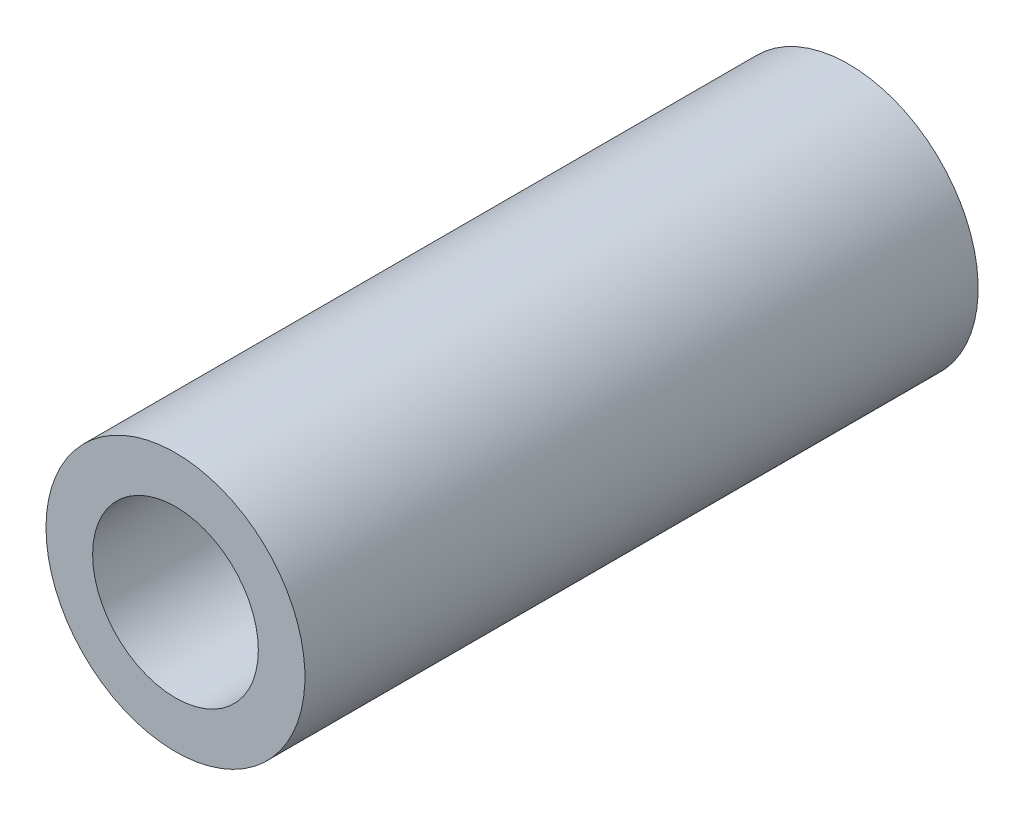
ISO-10303-21;
HEADER;
FILE_DESCRIPTION(('STEP AP214'),'2;1');
FILE_NAME('part.step','',(''),(''),'','','');
FILE_SCHEMA(('AUTOMOTIVE_DESIGN { 1 0 10303 214 1 1 1 1 }'));
ENDSEC;
DATA;
#1=APPLICATION_CONTEXT('core data for automotive mechanical design processes');
#2=APPLICATION_PROTOCOL_DEFINITION('international standard','automotive_design',2000,#1);
#3=PRODUCT_CONTEXT('',#1,'mechanical');
#4=PRODUCT('Part','Part','',(#3));
#5=PRODUCT_RELATED_PRODUCT_CATEGORY('part','',(#4));
#6=PRODUCT_DEFINITION_FORMATION('','',#4);
#7=PRODUCT_DEFINITION_CONTEXT('part definition',#1,'design');
#8=PRODUCT_DEFINITION('design','',#6,#7);
#9=PRODUCT_DEFINITION_SHAPE('','',#8);
#10=(LENGTH_UNIT() NAMED_UNIT(*) SI_UNIT(.MILLI.,.METRE.));
#11=(NAMED_UNIT(*) PLANE_ANGLE_UNIT() SI_UNIT($,.RADIAN.));
#12=(NAMED_UNIT(*) SI_UNIT($,.STERADIAN.) SOLID_ANGLE_UNIT());
#13=UNCERTAINTY_MEASURE_WITH_UNIT(LENGTH_MEASURE(1.E-05),#10,'distance_accuracy_value','');
#14=(GEOMETRIC_REPRESENTATION_CONTEXT(3) GLOBAL_UNCERTAINTY_ASSIGNED_CONTEXT((#13)) GLOBAL_UNIT_ASSIGNED_CONTEXT((#10,
#11,#12)) REPRESENTATION_CONTEXT('',''));
#15=CARTESIAN_POINT('',(0.,0.,0.));
#16=DIRECTION('',(0.,0.,1.));
#17=DIRECTION('',(1.,0.,0.));
#18=AXIS2_PLACEMENT_3D('',#15,#16,#17);
#19=CARTESIAN_POINT('',(0.,0.,13.));
#20=DIRECTION('',(0.,0.,1.));
#21=DIRECTION('',(1.,0.,0.));
#22=AXIS2_PLACEMENT_3D('',#19,#20,#21);
#23=PLANE('',#22);
#24=CARTESIAN_POINT('',(0.,0.,13.));
#25=DIRECTION('',(0.,0.,1.));
#26=DIRECTION('',(1.,0.,0.));
#27=AXIS2_PLACEMENT_3D('',#24,#25,#26);
#28=CIRCLE('',#27,2.5);
#29=CARTESIAN_POINT('',(-2.5,0.,13.));
#30=VERTEX_POINT('',#29);
#31=EDGE_CURVE('E10',#30,#30,#28,.T.);
#32=ORIENTED_EDGE('',*,*,#31,.T.);
#33=EDGE_LOOP('',(#32));
#34=FACE_BOUND('',#33,.T.);
#35=CARTESIAN_POINT('',(0.,0.,13.));
#36=DIRECTION('',(0.,0.,1.));
#37=DIRECTION('',(1.,0.,0.));
#38=AXIS2_PLACEMENT_3D('',#35,#36,#37);
#39=CIRCLE('',#38,1.6);
#40=CARTESIAN_POINT('',(-1.6,0.,13.));
#41=VERTEX_POINT('',#40);
#42=EDGE_CURVE('E46',#41,#41,#39,.T.);
#43=ORIENTED_EDGE('',*,*,#42,.F.);
#44=EDGE_LOOP('',(#43));
#45=FACE_BOUND('',#44,.T.);
#46=ADVANCED_FACE('F35',(#34,#45),#23,.T.);
#47=CARTESIAN_POINT('',(0.,0.,0.));
#48=DIRECTION('',(0.,0.,1.));
#49=DIRECTION('',(1.,0.,0.));
#50=AXIS2_PLACEMENT_3D('',#47,#48,#49);
#51=PLANE('',#50);
#52=CARTESIAN_POINT('',(0.,0.,0.));
#53=DIRECTION('',(0.,0.,1.));
#54=DIRECTION('',(1.,0.,0.));
#55=AXIS2_PLACEMENT_3D('',#52,#53,#54);
#56=CIRCLE('',#55,2.5);
#57=CARTESIAN_POINT('',(-2.5,0.,0.));
#58=VERTEX_POINT('',#57);
#59=EDGE_CURVE('E39',#58,#58,#56,.T.);
#60=ORIENTED_EDGE('',*,*,#59,.F.);
#61=EDGE_LOOP('',(#60));
#62=FACE_BOUND('',#61,.T.);
#63=CARTESIAN_POINT('',(0.,0.,0.));
#64=DIRECTION('',(0.,0.,1.));
#65=DIRECTION('',(1.,0.,0.));
#66=AXIS2_PLACEMENT_3D('',#63,#64,#65);
#67=CIRCLE('',#66,1.6);
#68=CARTESIAN_POINT('',(-1.6,0.,0.));
#69=VERTEX_POINT('',#68);
#70=EDGE_CURVE('E48',#69,#69,#67,.T.);
#71=ORIENTED_EDGE('',*,*,#70,.T.);
#72=EDGE_LOOP('',(#71));
#73=FACE_BOUND('',#72,.T.);
#74=ADVANCED_FACE('F58',(#62,#73),#51,.F.);
#75=CARTESIAN_POINT('',(0.,0.,13.));
#76=DIRECTION('',(0.,0.,-1.));
#77=DIRECTION('',(-1.,0.,0.));
#78=AXIS2_PLACEMENT_3D('',#75,#76,#77);
#79=CYLINDRICAL_SURFACE('',#78,2.5);
#80=CARTESIAN_POINT('',(-2.5,0.,13.));
#81=CARTESIAN_POINT('',(-2.5,0.,12.8645833333333));
#82=CARTESIAN_POINT('',(-2.5,0.,12.7291666666667));
#83=CARTESIAN_POINT('',(-2.5,0.,12.4583333333333));
#84=CARTESIAN_POINT('',(-2.5,0.,12.3229166666667));
#85=CARTESIAN_POINT('',(-2.5,0.,12.0520833333333));
#86=CARTESIAN_POINT('',(-2.5,0.,11.9166666666667));
#87=CARTESIAN_POINT('',(-2.5,0.,11.6458333333333));
#88=CARTESIAN_POINT('',(-2.5,0.,11.5104166666667));
#89=CARTESIAN_POINT('',(-2.5,0.,11.2395833333333));
#90=CARTESIAN_POINT('',(-2.5,0.,11.1041666666667));
#91=CARTESIAN_POINT('',(-2.5,0.,10.8333333333333));
#92=CARTESIAN_POINT('',(-2.5,0.,10.6979166666667));
#93=CARTESIAN_POINT('',(-2.5,0.,10.4270833333333));
#94=CARTESIAN_POINT('',(-2.5,0.,10.2916666666667));
#95=CARTESIAN_POINT('',(-2.5,0.,10.0208333333333));
#96=CARTESIAN_POINT('',(-2.5,0.,9.88541666666667));
#97=CARTESIAN_POINT('',(-2.5,0.,9.61458333333333));
#98=CARTESIAN_POINT('',(-2.5,0.,9.47916666666667));
#99=CARTESIAN_POINT('',(-2.5,0.,9.20833333333333));
#100=CARTESIAN_POINT('',(-2.5,0.,9.07291666666667));
#101=CARTESIAN_POINT('',(-2.5,0.,8.80208333333333));
#102=CARTESIAN_POINT('',(-2.5,0.,8.66666666666667));
#103=CARTESIAN_POINT('',(-2.5,0.,8.39583333333333));
#104=CARTESIAN_POINT('',(-2.5,0.,8.26041666666667));
#105=CARTESIAN_POINT('',(-2.5,0.,7.98958333333333));
#106=CARTESIAN_POINT('',(-2.5,0.,7.85416666666667));
#107=CARTESIAN_POINT('',(-2.5,0.,7.58333333333333));
#108=CARTESIAN_POINT('',(-2.5,0.,7.44791666666667));
#109=CARTESIAN_POINT('',(-2.5,0.,7.17708333333333));
#110=CARTESIAN_POINT('',(-2.5,0.,7.04166666666667));
#111=CARTESIAN_POINT('',(-2.5,0.,6.77083333333333));
#112=CARTESIAN_POINT('',(-2.5,0.,6.63541666666667));
#113=CARTESIAN_POINT('',(-2.5,0.,6.36458333333333));
#114=CARTESIAN_POINT('',(-2.5,0.,6.22916666666667));
#115=CARTESIAN_POINT('',(-2.5,0.,5.95833333333333));
#116=CARTESIAN_POINT('',(-2.5,0.,5.82291666666667));
#117=CARTESIAN_POINT('',(-2.5,0.,5.55208333333333));
#118=CARTESIAN_POINT('',(-2.5,0.,5.41666666666667));
#119=CARTESIAN_POINT('',(-2.5,0.,5.14583333333333));
#120=CARTESIAN_POINT('',(-2.5,0.,5.01041666666667));
#121=CARTESIAN_POINT('',(-2.5,0.,4.73958333333333));
#122=CARTESIAN_POINT('',(-2.5,0.,4.60416666666667));
#123=CARTESIAN_POINT('',(-2.5,0.,4.33333333333333));
#124=CARTESIAN_POINT('',(-2.5,0.,4.19791666666667));
#125=CARTESIAN_POINT('',(-2.5,0.,3.92708333333333));
#126=CARTESIAN_POINT('',(-2.5,0.,3.79166666666667));
#127=CARTESIAN_POINT('',(-2.5,0.,3.52083333333333));
#128=CARTESIAN_POINT('',(-2.5,0.,3.38541666666667));
#129=CARTESIAN_POINT('',(-2.5,0.,3.11458333333333));
#130=CARTESIAN_POINT('',(-2.5,0.,2.97916666666667));
#131=CARTESIAN_POINT('',(-2.5,0.,2.70833333333333));
#132=CARTESIAN_POINT('',(-2.5,0.,2.57291666666667));
#133=CARTESIAN_POINT('',(-2.5,0.,2.30208333333333));
#134=CARTESIAN_POINT('',(-2.5,0.,2.16666666666667));
#135=CARTESIAN_POINT('',(-2.5,0.,1.89583333333333));
#136=CARTESIAN_POINT('',(-2.5,0.,1.76041666666667));
#137=CARTESIAN_POINT('',(-2.5,0.,1.48958333333333));
#138=CARTESIAN_POINT('',(-2.5,0.,1.35416666666667));
#139=CARTESIAN_POINT('',(-2.5,0.,1.08333333333333));
#140=CARTESIAN_POINT('',(-2.5,0.,0.947916666666667));
#141=CARTESIAN_POINT('',(-2.5,0.,0.677083333333334));
#142=CARTESIAN_POINT('',(-2.5,0.,0.541666666666667));
#143=CARTESIAN_POINT('',(-2.5,0.,0.270833333333334));
#144=CARTESIAN_POINT('',(-2.5,0.,0.135416666666667));
#145=CARTESIAN_POINT('',(-2.5,0.,0.));
#146=B_SPLINE_CURVE_WITH_KNOTS('',3,(#80,#81,#82,#83,#84,#85,#86,#87,#88,#89,#90,#91,#92,#93,
#94,#95,#96,#97,#98,#99,#100,#101,#102,#103,#104,#105,#106,#107,#108,#109,#110,#111,#112,#113,
#114,#115,#116,#117,#118,#119,#120,#121,#122,#123,#124,#125,#126,#127,#128,#129,#130,#131,#132,
#133,#134,#135,#136,#137,#138,#139,#140,#141,#142,#143,#144,#145),.UNSPECIFIED.,.F.,.F.,(4,2,2,
2,2,2,2,2,2,2,2,2,2,2,2,2,2,2,2,2,2,2,2,2,2,2,2,2,2,2,2,2,4),(0.,0.406249999999999,
0.812499999999999,1.21875,1.625,2.03125,2.4375,2.84375,3.25,3.65625,4.0625,4.46875,4.875,
5.28125,5.6875,6.09375,6.5,6.90625,7.3125,7.71875,8.125,8.53125,8.9375,9.34375,9.75,10.15625,
10.5625,10.96875,11.375,11.78125,12.1875,12.59375,13.),.UNSPECIFIED.);
#147=EDGE_CURVE('BSEAM37',#30,#58,#146,.T.);
#148=ORIENTED_EDGE('',*,*,#31,.F.);
#149=ORIENTED_EDGE('',*,*,#59,.T.);
#150=ORIENTED_EDGE('',*,*,#147,.T.);
#151=ORIENTED_EDGE('',*,*,#147,.F.);
#152=EDGE_LOOP('',(#148,#150,#149,#151));
#153=FACE_BOUND('',#152,.T.);
#154=ADVANCED_FACE('F37',(#153),#79,.T.);
#155=CARTESIAN_POINT('',(0.,0.,13.));
#156=DIRECTION('',(0.,0.,-1.));
#157=DIRECTION('',(-1.,0.,0.));
#158=AXIS2_PLACEMENT_3D('',#155,#156,#157);
#159=CYLINDRICAL_SURFACE('',#158,1.6);
#160=CARTESIAN_POINT('',(-1.6,0.,13.));
#161=CARTESIAN_POINT('',(-1.6,0.,12.8645833333333));
#162=CARTESIAN_POINT('',(-1.6,0.,12.7291666666667));
#163=CARTESIAN_POINT('',(-1.6,0.,12.4583333333333));
#164=CARTESIAN_POINT('',(-1.6,0.,12.3229166666667));
#165=CARTESIAN_POINT('',(-1.6,0.,12.0520833333333));
#166=CARTESIAN_POINT('',(-1.6,0.,11.9166666666667));
#167=CARTESIAN_POINT('',(-1.6,0.,11.6458333333333));
#168=CARTESIAN_POINT('',(-1.6,0.,11.5104166666667));
#169=CARTESIAN_POINT('',(-1.6,0.,11.2395833333333));
#170=CARTESIAN_POINT('',(-1.6,0.,11.1041666666667));
#171=CARTESIAN_POINT('',(-1.6,0.,10.8333333333333));
#172=CARTESIAN_POINT('',(-1.6,0.,10.6979166666667));
#173=CARTESIAN_POINT('',(-1.6,0.,10.4270833333333));
#174=CARTESIAN_POINT('',(-1.6,0.,10.2916666666667));
#175=CARTESIAN_POINT('',(-1.6,0.,10.0208333333333));
#176=CARTESIAN_POINT('',(-1.6,0.,9.88541666666667));
#177=CARTESIAN_POINT('',(-1.6,0.,9.61458333333333));
#178=CARTESIAN_POINT('',(-1.6,0.,9.47916666666667));
#179=CARTESIAN_POINT('',(-1.6,0.,9.20833333333333));
#180=CARTESIAN_POINT('',(-1.6,0.,9.07291666666666));
#181=CARTESIAN_POINT('',(-1.6,0.,8.80208333333333));
#182=CARTESIAN_POINT('',(-1.6,0.,8.66666666666667));
#183=CARTESIAN_POINT('',(-1.6,0.,8.39583333333333));
#184=CARTESIAN_POINT('',(-1.6,0.,8.26041666666667));
#185=CARTESIAN_POINT('',(-1.6,0.,7.98958333333333));
#186=CARTESIAN_POINT('',(-1.6,0.,7.85416666666667));
#187=CARTESIAN_POINT('',(-1.6,0.,7.58333333333333));
#188=CARTESIAN_POINT('',(-1.6,0.,7.44791666666667));
#189=CARTESIAN_POINT('',(-1.6,0.,7.17708333333333));
#190=CARTESIAN_POINT('',(-1.6,0.,7.04166666666667));
#191=CARTESIAN_POINT('',(-1.6,0.,6.77083333333333));
#192=CARTESIAN_POINT('',(-1.6,0.,6.63541666666667));
#193=CARTESIAN_POINT('',(-1.6,0.,6.36458333333333));
#194=CARTESIAN_POINT('',(-1.6,0.,6.22916666666667));
#195=CARTESIAN_POINT('',(-1.6,0.,5.95833333333333));
#196=CARTESIAN_POINT('',(-1.6,0.,5.82291666666667));
#197=CARTESIAN_POINT('',(-1.6,0.,5.55208333333333));
#198=CARTESIAN_POINT('',(-1.6,0.,5.41666666666667));
#199=CARTESIAN_POINT('',(-1.6,0.,5.14583333333333));
#200=CARTESIAN_POINT('',(-1.6,0.,5.01041666666667));
#201=CARTESIAN_POINT('',(-1.6,0.,4.73958333333333));
#202=CARTESIAN_POINT('',(-1.6,0.,4.60416666666667));
#203=CARTESIAN_POINT('',(-1.6,0.,4.33333333333333));
#204=CARTESIAN_POINT('',(-1.6,0.,4.19791666666667));
#205=CARTESIAN_POINT('',(-1.6,0.,3.92708333333333));
#206=CARTESIAN_POINT('',(-1.6,0.,3.79166666666667));
#207=CARTESIAN_POINT('',(-1.6,0.,3.52083333333333));
#208=CARTESIAN_POINT('',(-1.6,0.,3.38541666666667));
#209=CARTESIAN_POINT('',(-1.6,0.,3.11458333333333));
#210=CARTESIAN_POINT('',(-1.6,0.,2.97916666666667));
#211=CARTESIAN_POINT('',(-1.6,0.,2.70833333333333));
#212=CARTESIAN_POINT('',(-1.6,0.,2.57291666666667));
#213=CARTESIAN_POINT('',(-1.6,0.,2.30208333333333));
#214=CARTESIAN_POINT('',(-1.6,0.,2.16666666666667));
#215=CARTESIAN_POINT('',(-1.6,0.,1.89583333333333));
#216=CARTESIAN_POINT('',(-1.6,0.,1.76041666666667));
#217=CARTESIAN_POINT('',(-1.6,0.,1.48958333333333));
#218=CARTESIAN_POINT('',(-1.6,0.,1.35416666666667));
#219=CARTESIAN_POINT('',(-1.6,0.,1.08333333333333));
#220=CARTESIAN_POINT('',(-1.6,0.,0.947916666666667));
#221=CARTESIAN_POINT('',(-1.6,0.,0.677083333333334));
#222=CARTESIAN_POINT('',(-1.6,0.,0.541666666666667));
#223=CARTESIAN_POINT('',(-1.6,0.,0.270833333333334));
#224=CARTESIAN_POINT('',(-1.6,0.,0.135416666666667));
#225=CARTESIAN_POINT('',(-1.6,0.,0.));
#226=B_SPLINE_CURVE_WITH_KNOTS('',3,(#160,#161,#162,#163,#164,#165,#166,#167,#168,#169,#170,
#171,#172,#173,#174,#175,#176,#177,#178,#179,#180,#181,#182,#183,#184,#185,#186,#187,#188,#189,
#190,#191,#192,#193,#194,#195,#196,#197,#198,#199,#200,#201,#202,#203,#204,#205,#206,#207,#208,
#209,#210,#211,#212,#213,#214,#215,#216,#217,#218,#219,#220,#221,#222,#223,#224,#225),
.UNSPECIFIED.,.F.,.F.,(4,2,2,2,2,2,2,2,2,2,2,2,2,2,2,2,2,2,2,2,2,2,2,2,2,2,2,2,2,2,2,2,4),(0.,
0.40625,0.812500000000001,1.21875,1.625,2.03125,2.4375,2.84375,3.25,3.65625,4.0625,4.46875,
4.875,5.28125,5.6875,6.09375,6.5,6.90625,7.3125,7.71875,8.125,8.53125,8.9375,9.34375,9.75,
10.15625,10.5625,10.96875,11.375,11.78125,12.1875,12.59375,13.),.UNSPECIFIED.);
#227=EDGE_CURVE('BSEAM54',#41,#69,#226,.T.);
#228=ORIENTED_EDGE('',*,*,#42,.T.);
#229=ORIENTED_EDGE('',*,*,#70,.F.);
#230=ORIENTED_EDGE('',*,*,#227,.T.);
#231=ORIENTED_EDGE('',*,*,#227,.F.);
#232=EDGE_LOOP('',(#228,#230,#229,#231));
#233=FACE_BOUND('',#232,.T.);
#234=ADVANCED_FACE('F54',(#233),#159,.F.);
#235=CLOSED_SHELL('',(#46,#74,#154,#234));
#236=MANIFOLD_SOLID_BREP('B2',#235);
#237=ADVANCED_BREP_SHAPE_REPRESENTATION('',(#18,#236),#14);
#238=SHAPE_DEFINITION_REPRESENTATION(#9,#237);
ENDSEC;
END-ISO-10303-21;
